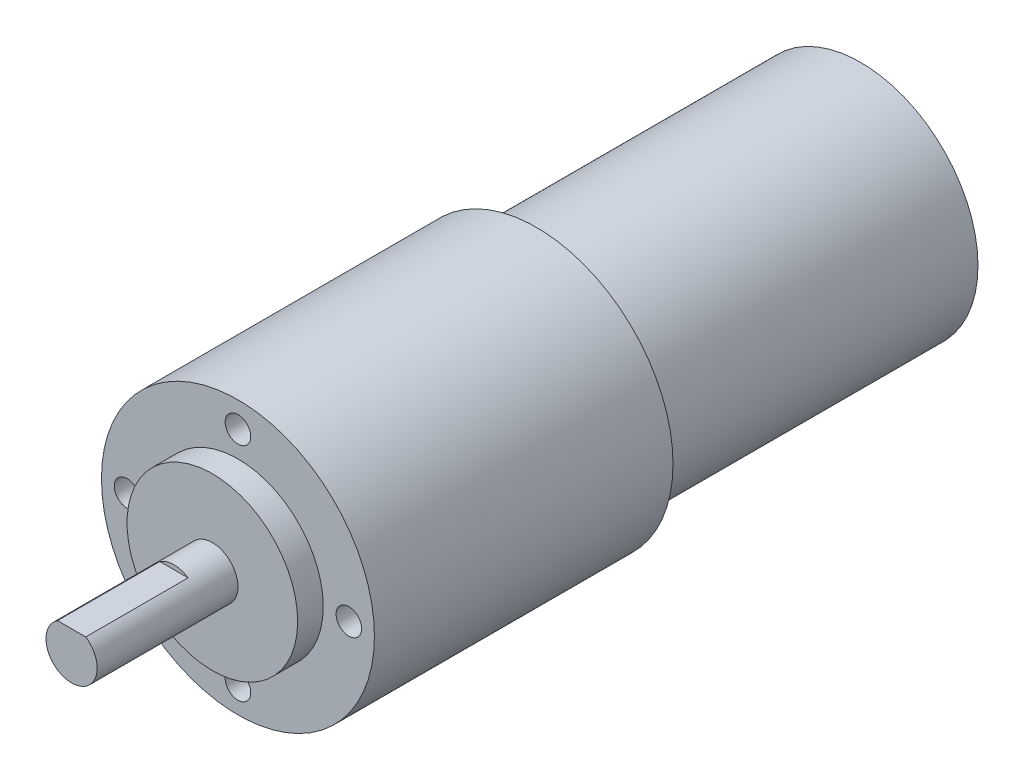
ISO-10303-21;
HEADER;
FILE_DESCRIPTION(('STEP AP214'),'2;1');
FILE_NAME('part.step','',(''),(''),'','','');
FILE_SCHEMA(('AUTOMOTIVE_DESIGN { 1 0 10303 214 1 1 1 1 }'));
ENDSEC;
DATA;
#1=APPLICATION_CONTEXT('core data for automotive mechanical design processes');
#2=APPLICATION_PROTOCOL_DEFINITION('international standard','automotive_design',2000,#1);
#3=PRODUCT_CONTEXT('',#1,'mechanical');
#4=PRODUCT('Part','Part','',(#3));
#5=PRODUCT_RELATED_PRODUCT_CATEGORY('part','',(#4));
#6=PRODUCT_DEFINITION_FORMATION('','',#4);
#7=PRODUCT_DEFINITION_CONTEXT('part definition',#1,'design');
#8=PRODUCT_DEFINITION('design','',#6,#7);
#9=PRODUCT_DEFINITION_SHAPE('','',#8);
#10=(LENGTH_UNIT() NAMED_UNIT(*) SI_UNIT(.MILLI.,.METRE.));
#11=(NAMED_UNIT(*) PLANE_ANGLE_UNIT() SI_UNIT($,.RADIAN.));
#12=(NAMED_UNIT(*) SI_UNIT($,.STERADIAN.) SOLID_ANGLE_UNIT());
#13=UNCERTAINTY_MEASURE_WITH_UNIT(LENGTH_MEASURE(1.E-05),#10,'distance_accuracy_value','');
#14=(GEOMETRIC_REPRESENTATION_CONTEXT(3) GLOBAL_UNCERTAINTY_ASSIGNED_CONTEXT((#13)) GLOBAL_UNIT_ASSIGNED_CONTEXT((#10,
#11,#12)) REPRESENTATION_CONTEXT('',''));
#15=CARTESIAN_POINT('',(0.,0.,0.));
#16=DIRECTION('',(0.,0.,1.));
#17=DIRECTION('',(1.,0.,0.));
#18=AXIS2_PLACEMENT_3D('',#15,#16,#17);
#19=CARTESIAN_POINT('',(0.,0.,0.));
#20=DIRECTION('',(0.,0.,1.));
#21=DIRECTION('',(1.,0.,0.));
#22=AXIS2_PLACEMENT_3D('',#19,#20,#21);
#23=PLANE('',#22);
#24=CARTESIAN_POINT('',(0.,0.,0.));
#25=DIRECTION('',(0.,0.,1.));
#26=DIRECTION('',(1.,0.,0.));
#27=AXIS2_PLACEMENT_3D('',#24,#25,#26);
#28=CIRCLE('',#27,16.);
#29=CARTESIAN_POINT('',(16.,0.,0.));
#30=VERTEX_POINT('',#29);
#31=EDGE_CURVE('E83',#30,#30,#28,.T.);
#32=ORIENTED_EDGE('',*,*,#31,.F.);
#33=EDGE_LOOP('',(#32));
#34=FACE_BOUND('',#33,.T.);
#35=CARTESIAN_POINT('',(0.,0.,0.));
#36=DIRECTION('',(0.,0.,1.));
#37=DIRECTION('',(1.,0.,0.));
#38=AXIS2_PLACEMENT_3D('',#35,#36,#37);
#39=CIRCLE('',#38,13.75);
#40=CARTESIAN_POINT('',(13.75,0.,0.));
#41=VERTEX_POINT('',#40);
#42=EDGE_CURVE('E11',#41,#41,#39,.F.);
#43=ORIENTED_EDGE('',*,*,#42,.F.);
#44=EDGE_LOOP('',(#43));
#45=FACE_BOUND('',#44,.T.);
#46=ADVANCED_FACE('F32',(#34,#45),#23,.F.);
#47=CARTESIAN_POINT('',(0.,0.,54.5));
#48=DIRECTION('',(0.,0.,-1.));
#49=DIRECTION('',(-1.,0.,0.));
#50=AXIS2_PLACEMENT_3D('',#47,#48,#49);
#51=CYLINDRICAL_SURFACE('',#50,3.);
#52=CARTESIAN_POINT('',(0.,0.,38.));
#53=DIRECTION('',(0.,0.,1.));
#54=DIRECTION('',(1.,0.,0.));
#55=AXIS2_PLACEMENT_3D('',#52,#53,#54);
#56=CIRCLE('',#55,3.);
#57=CARTESIAN_POINT('',(3.,0.,38.));
#58=VERTEX_POINT('',#57);
#59=EDGE_CURVE('E70',#58,#58,#56,.T.);
#60=ORIENTED_EDGE('',*,*,#59,.T.);
#61=EDGE_LOOP('',(#60));
#62=FACE_BOUND('',#61,.T.);
#63=DIRECTION('',(0.,0.,-1.));
#64=VECTOR('',#63,1.);
#65=CARTESIAN_POINT('',(-1.6583123951777,2.5,54.5));
#66=LINE('',#65,#64);
#67=CARTESIAN_POINT('',(-1.6583123951777,2.5,42.5));
#68=VERTEX_POINT('',#67);
#69=CARTESIAN_POINT('',(-1.6583123951777,2.5,54.5));
#70=VERTEX_POINT('',#69);
#71=EDGE_CURVE('E47',#68,#70,#66,.F.);
#72=ORIENTED_EDGE('',*,*,#71,.F.);
#73=CARTESIAN_POINT('',(0.,0.,42.5));
#74=DIRECTION('',(0.,0.,-1.));
#75=DIRECTION('',(-1.,0.,0.));
#76=AXIS2_PLACEMENT_3D('',#73,#74,#75);
#77=CIRCLE('',#76,3.);
#78=CARTESIAN_POINT('',(1.6583123951777,2.5,42.5));
#79=VERTEX_POINT('',#78);
#80=EDGE_CURVE('E40',#68,#79,#77,.T.);
#81=ORIENTED_EDGE('',*,*,#80,.T.);
#82=DIRECTION('',(0.,0.,-1.));
#83=VECTOR('',#82,1.);
#84=CARTESIAN_POINT('',(1.6583123951777,2.5,54.5));
#85=LINE('',#84,#83);
#86=CARTESIAN_POINT('',(1.6583123951777,2.5,54.5));
#87=VERTEX_POINT('',#86);
#88=EDGE_CURVE('E61',#87,#79,#85,.T.);
#89=ORIENTED_EDGE('',*,*,#88,.F.);
#90=CARTESIAN_POINT('',(0.,0.,54.5));
#91=DIRECTION('',(0.,0.,1.));
#92=DIRECTION('',(1.,0.,0.));
#93=AXIS2_PLACEMENT_3D('',#90,#91,#92);
#94=CIRCLE('',#93,3.);
#95=EDGE_CURVE('E69',#70,#87,#94,.T.);
#96=ORIENTED_EDGE('',*,*,#95,.F.);
#97=EDGE_LOOP('',(#72,#81,#89,#96));
#98=FACE_BOUND('',#97,.T.);
#99=ADVANCED_FACE('F68',(#62,#98),#51,.T.);
#100=CARTESIAN_POINT('',(0.,0.,54.5));
#101=DIRECTION('',(0.,0.,1.));
#102=DIRECTION('',(1.,0.,0.));
#103=AXIS2_PLACEMENT_3D('',#100,#101,#102);
#104=PLANE('',#103);
#105=ORIENTED_EDGE('',*,*,#95,.T.);
#106=DIRECTION('',(-1.,0.,0.));
#107=VECTOR('',#106,1.);
#108=CARTESIAN_POINT('',(0.,2.5,54.5));
#109=LINE('',#108,#107);
#110=EDGE_CURVE('E58',#87,#70,#109,.T.);
#111=ORIENTED_EDGE('',*,*,#110,.T.);
#112=EDGE_LOOP('',(#105,#111));
#113=FACE_BOUND('',#112,.T.);
#114=ADVANCED_FACE('F72',(#113),#104,.T.);
#115=CARTESIAN_POINT('',(0.,0.,38.));
#116=DIRECTION('',(0.,0.,1.));
#117=DIRECTION('',(1.,0.,0.));
#118=AXIS2_PLACEMENT_3D('',#115,#116,#117);
#119=PLANE('',#118);
#120=CARTESIAN_POINT('',(0.,0.,38.));
#121=DIRECTION('',(0.,0.,1.));
#122=DIRECTION('',(1.,0.,0.));
#123=AXIS2_PLACEMENT_3D('',#120,#121,#122);
#124=CIRCLE('',#123,10.);
#125=CARTESIAN_POINT('',(10.,0.,38.));
#126=VERTEX_POINT('',#125);
#127=EDGE_CURVE('E76',#126,#126,#124,.T.);
#128=ORIENTED_EDGE('',*,*,#127,.T.);
#129=EDGE_LOOP('',(#128));
#130=FACE_BOUND('',#129,.T.);
#131=ORIENTED_EDGE('',*,*,#59,.F.);
#132=EDGE_LOOP('',(#131));
#133=FACE_BOUND('',#132,.T.);
#134=ADVANCED_FACE('F117',(#130,#133),#119,.T.);
#135=CARTESIAN_POINT('',(0.,0.,35.));
#136=DIRECTION('',(0.,0.,1.));
#137=DIRECTION('',(1.,0.,0.));
#138=AXIS2_PLACEMENT_3D('',#135,#136,#137);
#139=PLANE('',#138);
#140=CARTESIAN_POINT('',(0.,-13.,35.));
#141=DIRECTION('',(0.,0.,1.));
#142=DIRECTION('',(-1.,0.,0.));
#143=AXIS2_PLACEMENT_3D('',#140,#141,#142);
#144=CIRCLE('',#143,1.5);
#145=CARTESIAN_POINT('',(-1.5,-13.,35.));
#146=VERTEX_POINT('',#145);
#147=EDGE_CURVE('E137',#146,#146,#144,.T.);
#148=ORIENTED_EDGE('',*,*,#147,.F.);
#149=EDGE_LOOP('',(#148));
#150=FACE_BOUND('',#149,.T.);
#151=CARTESIAN_POINT('',(13.,0.,35.));
#152=DIRECTION('',(0.,0.,1.));
#153=DIRECTION('',(-1.,0.,0.));
#154=AXIS2_PLACEMENT_3D('',#151,#152,#153);
#155=CIRCLE('',#154,1.5);
#156=CARTESIAN_POINT('',(11.5,0.,35.));
#157=VERTEX_POINT('',#156);
#158=EDGE_CURVE('E141',#157,#157,#155,.T.);
#159=ORIENTED_EDGE('',*,*,#158,.F.);
#160=EDGE_LOOP('',(#159));
#161=FACE_BOUND('',#160,.T.);
#162=CARTESIAN_POINT('',(-13.,0.,35.));
#163=DIRECTION('',(0.,0.,1.));
#164=DIRECTION('',(1.,0.,0.));
#165=AXIS2_PLACEMENT_3D('',#162,#163,#164);
#166=CIRCLE('',#165,1.5);
#167=CARTESIAN_POINT('',(-11.5,0.,35.));
#168=VERTEX_POINT('',#167);
#169=EDGE_CURVE('E145',#168,#168,#166,.T.);
#170=ORIENTED_EDGE('',*,*,#169,.F.);
#171=EDGE_LOOP('',(#170));
#172=FACE_BOUND('',#171,.T.);
#173=CARTESIAN_POINT('',(0.,13.,35.));
#174=DIRECTION('',(0.,0.,1.));
#175=DIRECTION('',(1.,0.,0.));
#176=AXIS2_PLACEMENT_3D('',#173,#174,#175);
#177=CIRCLE('',#176,1.5);
#178=CARTESIAN_POINT('',(1.5,13.,35.));
#179=VERTEX_POINT('',#178);
#180=EDGE_CURVE('E149',#179,#179,#177,.T.);
#181=ORIENTED_EDGE('',*,*,#180,.F.);
#182=EDGE_LOOP('',(#181));
#183=FACE_BOUND('',#182,.T.);
#184=CARTESIAN_POINT('',(0.,0.,35.));
#185=DIRECTION('',(0.,0.,1.));
#186=DIRECTION('',(1.,0.,0.));
#187=AXIS2_PLACEMENT_3D('',#184,#185,#186);
#188=CIRCLE('',#187,16.);
#189=CARTESIAN_POINT('',(16.,0.,35.));
#190=VERTEX_POINT('',#189);
#191=EDGE_CURVE('E65',#190,#190,#188,.T.);
#192=ORIENTED_EDGE('',*,*,#191,.T.);
#193=EDGE_LOOP('',(#192));
#194=FACE_BOUND('',#193,.T.);
#195=CARTESIAN_POINT('',(0.,0.,35.));
#196=DIRECTION('',(0.,0.,1.));
#197=DIRECTION('',(1.,0.,0.));
#198=AXIS2_PLACEMENT_3D('',#195,#196,#197);
#199=CIRCLE('',#198,10.);
#200=CARTESIAN_POINT('',(10.,0.,35.));
#201=VERTEX_POINT('',#200);
#202=EDGE_CURVE('E73',#201,#201,#199,.T.);
#203=ORIENTED_EDGE('',*,*,#202,.F.);
#204=EDGE_LOOP('',(#203));
#205=FACE_BOUND('',#204,.T.);
#206=ADVANCED_FACE('F123',(#150,#161,#172,#183,#194,#205),#139,.T.);
#207=CARTESIAN_POINT('',(0.,0.,35.));
#208=DIRECTION('',(0.,0.,-1.));
#209=DIRECTION('',(-1.,0.,0.));
#210=AXIS2_PLACEMENT_3D('',#207,#208,#209);
#211=CYLINDRICAL_SURFACE('',#210,16.);
#212=ORIENTED_EDGE('',*,*,#191,.F.);
#213=EDGE_LOOP('',(#212));
#214=FACE_BOUND('',#213,.T.);
#215=ORIENTED_EDGE('',*,*,#31,.T.);
#216=EDGE_LOOP('',(#215));
#217=FACE_BOUND('',#216,.T.);
#218=ADVANCED_FACE('F34',(#214,#217),#211,.T.);
#219=CARTESIAN_POINT('',(0.,0.,38.));
#220=DIRECTION('',(0.,0.,-1.));
#221=DIRECTION('',(-1.,0.,0.));
#222=AXIS2_PLACEMENT_3D('',#219,#220,#221);
#223=CYLINDRICAL_SURFACE('',#222,10.);
#224=ORIENTED_EDGE('',*,*,#127,.F.);
#225=EDGE_LOOP('',(#224));
#226=FACE_BOUND('',#225,.T.);
#227=ORIENTED_EDGE('',*,*,#202,.T.);
#228=EDGE_LOOP('',(#227));
#229=FACE_BOUND('',#228,.T.);
#230=ADVANCED_FACE('F114',(#226,#229),#223,.T.);
#231=CARTESIAN_POINT('',(-4.62178809809189,2.5,42.5));
#232=DIRECTION('',(0.,0.,-1.));
#233=DIRECTION('',(-1.,0.,0.));
#234=AXIS2_PLACEMENT_3D('',#231,#232,#233);
#235=PLANE('',#234);
#236=DIRECTION('',(-1.,0.,0.));
#237=VECTOR('',#236,1.);
#238=CARTESIAN_POINT('',(-4.62178809809189,2.5,42.5));
#239=LINE('',#238,#237);
#240=EDGE_CURVE('E167',#79,#68,#239,.T.);
#241=ORIENTED_EDGE('',*,*,#240,.F.);
#242=ORIENTED_EDGE('',*,*,#80,.F.);
#243=EDGE_LOOP('',(#241,#242));
#244=FACE_BOUND('',#243,.T.);
#245=ADVANCED_FACE('F107',(#244),#235,.F.);
#246=CARTESIAN_POINT('',(4.62178809809189,2.5,54.5));
#247=DIRECTION('',(0.,1.,0.));
#248=DIRECTION('',(0.,0.,1.));
#249=AXIS2_PLACEMENT_3D('',#246,#247,#248);
#250=PLANE('',#249);
#251=ORIENTED_EDGE('',*,*,#88,.T.);
#252=ORIENTED_EDGE('',*,*,#240,.T.);
#253=ORIENTED_EDGE('',*,*,#71,.T.);
#254=ORIENTED_EDGE('',*,*,#110,.F.);
#255=EDGE_LOOP('',(#251,#252,#253,#254));
#256=FACE_BOUND('',#255,.T.);
#257=ADVANCED_FACE('F60',(#256),#250,.T.);
#258=CARTESIAN_POINT('',(0.,0.,-38.));
#259=DIRECTION('',(0.,0.,1.));
#260=DIRECTION('',(1.,0.,0.));
#261=AXIS2_PLACEMENT_3D('',#258,#259,#260);
#262=CYLINDRICAL_SURFACE('',#261,13.75);
#263=CARTESIAN_POINT('',(0.,0.,-38.));
#264=DIRECTION('',(0.,0.,-1.));
#265=DIRECTION('',(-1.,0.,0.));
#266=AXIS2_PLACEMENT_3D('',#263,#264,#265);
#267=CIRCLE('',#266,13.75);
#268=CARTESIAN_POINT('',(-13.75,0.,-38.));
#269=VERTEX_POINT('',#268);
#270=EDGE_CURVE('E159',#269,#269,#267,.T.);
#271=ORIENTED_EDGE('',*,*,#270,.F.);
#272=EDGE_LOOP('',(#271));
#273=FACE_BOUND('',#272,.T.);
#274=ORIENTED_EDGE('',*,*,#42,.T.);
#275=EDGE_LOOP('',(#274));
#276=FACE_BOUND('',#275,.T.);
#277=ADVANCED_FACE('F95',(#273,#276),#262,.T.);
#278=CARTESIAN_POINT('',(0.,0.,-38.));
#279=DIRECTION('',(0.,0.,-1.));
#280=DIRECTION('',(-1.,0.,0.));
#281=AXIS2_PLACEMENT_3D('',#278,#279,#280);
#282=PLANE('',#281);
#283=ORIENTED_EDGE('',*,*,#270,.T.);
#284=EDGE_LOOP('',(#283));
#285=FACE_BOUND('',#284,.T.);
#286=ADVANCED_FACE('F97',(#285),#282,.T.);
#287=CARTESIAN_POINT('',(0.,13.,30.));
#288=DIRECTION('',(0.,0.,1.));
#289=DIRECTION('',(1.,0.,0.));
#290=AXIS2_PLACEMENT_3D('',#287,#288,#289);
#291=CYLINDRICAL_SURFACE('',#290,1.5);
#292=CARTESIAN_POINT('',(0.,13.,30.));
#293=DIRECTION('',(0.,0.,1.));
#294=DIRECTION('',(1.,0.,0.));
#295=AXIS2_PLACEMENT_3D('',#292,#293,#294);
#296=CIRCLE('',#295,1.5);
#297=CARTESIAN_POINT('',(1.5,13.,30.));
#298=VERTEX_POINT('',#297);
#299=EDGE_CURVE('E155',#298,#298,#296,.T.);
#300=ORIENTED_EDGE('',*,*,#299,.F.);
#301=EDGE_LOOP('',(#300));
#302=FACE_BOUND('',#301,.T.);
#303=ORIENTED_EDGE('',*,*,#180,.T.);
#304=EDGE_LOOP('',(#303));
#305=FACE_BOUND('',#304,.T.);
#306=ADVANCED_FACE('F104',(#302,#305),#291,.F.);
#307=CARTESIAN_POINT('',(0.,13.,30.));
#308=DIRECTION('',(0.,0.,1.));
#309=DIRECTION('',(1.,0.,0.));
#310=AXIS2_PLACEMENT_3D('',#307,#308,#309);
#311=PLANE('',#310);
#312=ORIENTED_EDGE('',*,*,#299,.T.);
#313=EDGE_LOOP('',(#312));
#314=FACE_BOUND('',#313,.T.);
#315=ADVANCED_FACE('F204',(#314),#311,.T.);
#316=CARTESIAN_POINT('',(-13.,0.,30.));
#317=DIRECTION('',(0.,0.,1.));
#318=DIRECTION('',(1.,0.,0.));
#319=AXIS2_PLACEMENT_3D('',#316,#317,#318);
#320=CYLINDRICAL_SURFACE('',#319,1.5);
#321=CARTESIAN_POINT('',(-13.,0.,30.));
#322=DIRECTION('',(0.,0.,1.));
#323=DIRECTION('',(1.,0.,0.));
#324=AXIS2_PLACEMENT_3D('',#321,#322,#323);
#325=CIRCLE('',#324,1.5);
#326=CARTESIAN_POINT('',(-11.5,0.,30.));
#327=VERTEX_POINT('',#326);
#328=EDGE_CURVE('E156',#327,#327,#325,.T.);
#329=ORIENTED_EDGE('',*,*,#328,.F.);
#330=EDGE_LOOP('',(#329));
#331=FACE_BOUND('',#330,.T.);
#332=ORIENTED_EDGE('',*,*,#169,.T.);
#333=EDGE_LOOP('',(#332));
#334=FACE_BOUND('',#333,.T.);
#335=ADVANCED_FACE('F200',(#331,#334),#320,.F.);
#336=CARTESIAN_POINT('',(-13.,0.,30.));
#337=DIRECTION('',(0.,0.,1.));
#338=DIRECTION('',(1.,0.,0.));
#339=AXIS2_PLACEMENT_3D('',#336,#337,#338);
#340=PLANE('',#339);
#341=ORIENTED_EDGE('',*,*,#328,.T.);
#342=EDGE_LOOP('',(#341));
#343=FACE_BOUND('',#342,.T.);
#344=ADVANCED_FACE('F196',(#343),#340,.T.);
#345=CARTESIAN_POINT('',(13.,0.,30.));
#346=DIRECTION('',(0.,0.,1.));
#347=DIRECTION('',(1.,0.,0.));
#348=AXIS2_PLACEMENT_3D('',#345,#346,#347);
#349=CYLINDRICAL_SURFACE('',#348,1.5);
#350=CARTESIAN_POINT('',(13.,0.,30.));
#351=DIRECTION('',(0.,0.,1.));
#352=DIRECTION('',(-1.,0.,0.));
#353=AXIS2_PLACEMENT_3D('',#350,#351,#352);
#354=CIRCLE('',#353,1.5);
#355=CARTESIAN_POINT('',(11.5,0.,30.));
#356=VERTEX_POINT('',#355);
#357=EDGE_CURVE('E168',#356,#356,#354,.T.);
#358=ORIENTED_EDGE('',*,*,#357,.F.);
#359=EDGE_LOOP('',(#358));
#360=FACE_BOUND('',#359,.T.);
#361=ORIENTED_EDGE('',*,*,#158,.T.);
#362=EDGE_LOOP('',(#361));
#363=FACE_BOUND('',#362,.T.);
#364=ADVANCED_FACE('F190',(#360,#363),#349,.F.);
#365=CARTESIAN_POINT('',(13.,0.,30.));
#366=DIRECTION('',(0.,0.,-1.));
#367=DIRECTION('',(-1.,0.,0.));
#368=AXIS2_PLACEMENT_3D('',#365,#366,#367);
#369=PLANE('',#368);
#370=ORIENTED_EDGE('',*,*,#357,.T.);
#371=EDGE_LOOP('',(#370));
#372=FACE_BOUND('',#371,.T.);
#373=ADVANCED_FACE('F183',(#372),#369,.F.);
#374=CARTESIAN_POINT('',(0.,-13.,30.));
#375=DIRECTION('',(0.,0.,1.));
#376=DIRECTION('',(1.,0.,0.));
#377=AXIS2_PLACEMENT_3D('',#374,#375,#376);
#378=CYLINDRICAL_SURFACE('',#377,1.5);
#379=CARTESIAN_POINT('',(0.,-13.,30.));
#380=DIRECTION('',(0.,0.,1.));
#381=DIRECTION('',(-1.,0.,0.));
#382=AXIS2_PLACEMENT_3D('',#379,#380,#381);
#383=CIRCLE('',#382,1.5);
#384=CARTESIAN_POINT('',(-1.5,-13.,30.));
#385=VERTEX_POINT('',#384);
#386=EDGE_CURVE('E171',#385,#385,#383,.T.);
#387=ORIENTED_EDGE('',*,*,#386,.F.);
#388=EDGE_LOOP('',(#387));
#389=FACE_BOUND('',#388,.T.);
#390=ORIENTED_EDGE('',*,*,#147,.T.);
#391=EDGE_LOOP('',(#390));
#392=FACE_BOUND('',#391,.T.);
#393=ADVANCED_FACE('F180',(#389,#392),#378,.F.);
#394=CARTESIAN_POINT('',(0.,-13.,30.));
#395=DIRECTION('',(0.,0.,-1.));
#396=DIRECTION('',(-1.,0.,0.));
#397=AXIS2_PLACEMENT_3D('',#394,#395,#396);
#398=PLANE('',#397);
#399=ORIENTED_EDGE('',*,*,#386,.T.);
#400=EDGE_LOOP('',(#399));
#401=FACE_BOUND('',#400,.T.);
#402=ADVANCED_FACE('F178',(#401),#398,.F.);
#403=CLOSED_SHELL('',(#46,#99,#114,#134,#206,#218,#230,#245,#257,#277,#286,#306,#315,#335,#344,
#364,#373,#393,#402));
#404=MANIFOLD_SOLID_BREP('B2',#403);
#405=ADVANCED_BREP_SHAPE_REPRESENTATION('',(#18,#404),#14);
#406=SHAPE_DEFINITION_REPRESENTATION(#9,#405);
ENDSEC;
END-ISO-10303-21;
